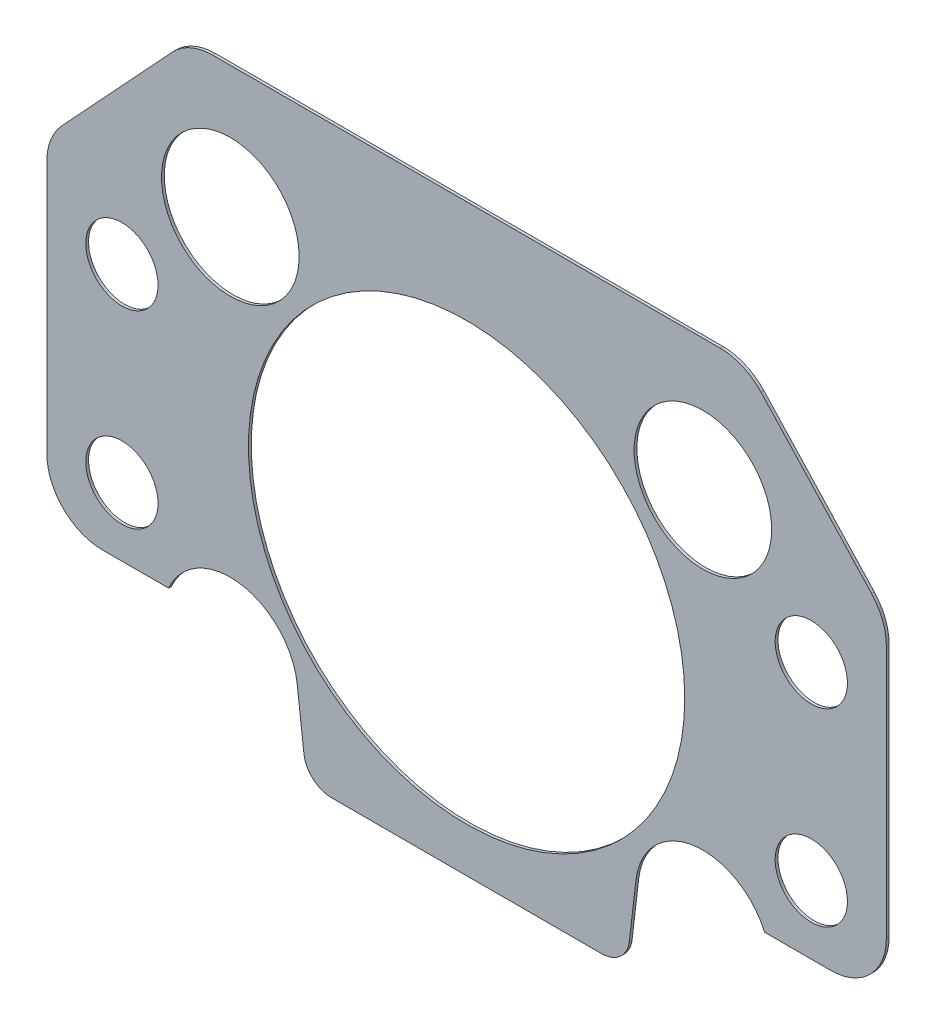
ISO-10303-21;
HEADER;
FILE_DESCRIPTION(('STEP AP214'),'2;1');
FILE_NAME('part.step','',(''),(''),'','','');
FILE_SCHEMA(('AUTOMOTIVE_DESIGN { 1 0 10303 214 1 1 1 1 }'));
ENDSEC;
DATA;
#1=APPLICATION_CONTEXT('core data for automotive mechanical design processes');
#2=APPLICATION_PROTOCOL_DEFINITION('international standard','automotive_design',2000,#1);
#3=PRODUCT_CONTEXT('',#1,'mechanical');
#4=PRODUCT('Part','Part','',(#3));
#5=PRODUCT_RELATED_PRODUCT_CATEGORY('part','',(#4));
#6=PRODUCT_DEFINITION_FORMATION('','',#4);
#7=PRODUCT_DEFINITION_CONTEXT('part definition',#1,'design');
#8=PRODUCT_DEFINITION('design','',#6,#7);
#9=PRODUCT_DEFINITION_SHAPE('','',#8);
#10=(LENGTH_UNIT() NAMED_UNIT(*) SI_UNIT(.MILLI.,.METRE.));
#11=(NAMED_UNIT(*) PLANE_ANGLE_UNIT() SI_UNIT($,.RADIAN.));
#12=(NAMED_UNIT(*) SI_UNIT($,.STERADIAN.) SOLID_ANGLE_UNIT());
#13=UNCERTAINTY_MEASURE_WITH_UNIT(LENGTH_MEASURE(1.E-05),#10,'distance_accuracy_value','');
#14=(GEOMETRIC_REPRESENTATION_CONTEXT(3) GLOBAL_UNCERTAINTY_ASSIGNED_CONTEXT((#13)) GLOBAL_UNIT_ASSIGNED_CONTEXT((#10,
#11,#12)) REPRESENTATION_CONTEXT('',''));
#15=CARTESIAN_POINT('',(0.,0.,0.));
#16=DIRECTION('',(0.,0.,1.));
#17=DIRECTION('',(1.,0.,0.));
#18=AXIS2_PLACEMENT_3D('',#15,#16,#17);
#19=CARTESIAN_POINT('',(-91.2703031380376,95.5,1.));
#20=DIRECTION('',(0.,0.,1.));
#21=DIRECTION('',(1.,0.,0.));
#22=AXIS2_PLACEMENT_3D('',#19,#20,#21);
#23=PLANE('',#22);
#24=CARTESIAN_POINT('',(-124.,-34.,1.));
#25=DIRECTION('',(0.,0.,1.));
#26=DIRECTION('',(1.,0.,0.));
#27=AXIS2_PLACEMENT_3D('',#24,#25,#26);
#28=CIRCLE('',#27,13.);
#29=CARTESIAN_POINT('',(-111.,-34.,1.));
#30=VERTEX_POINT('',#29);
#31=EDGE_CURVE('E645',#30,#30,#28,.T.);
#32=ORIENTED_EDGE('',*,*,#31,.F.);
#33=EDGE_LOOP('',(#32));
#34=FACE_BOUND('',#33,.T.);
#35=CARTESIAN_POINT('',(124.,34.,1.));
#36=DIRECTION('',(0.,0.,1.));
#37=DIRECTION('',(1.,0.,0.));
#38=AXIS2_PLACEMENT_3D('',#35,#36,#37);
#39=CIRCLE('',#38,13.);
#40=CARTESIAN_POINT('',(137.,34.,1.));
#41=VERTEX_POINT('',#40);
#42=EDGE_CURVE('E657',#41,#41,#39,.T.);
#43=ORIENTED_EDGE('',*,*,#42,.F.);
#44=EDGE_LOOP('',(#43));
#45=FACE_BOUND('',#44,.T.);
#46=CARTESIAN_POINT('',(85.,68.25,1.));
#47=DIRECTION('',(0.,0.,1.));
#48=DIRECTION('',(1.,0.,0.));
#49=AXIS2_PLACEMENT_3D('',#46,#47,#48);
#50=CIRCLE('',#49,24.7499999999999);
#51=CARTESIAN_POINT('',(109.75,68.25,1.));
#52=VERTEX_POINT('',#51);
#53=EDGE_CURVE('E669',#52,#52,#50,.T.);
#54=ORIENTED_EDGE('',*,*,#53,.F.);
#55=EDGE_LOOP('',(#54));
#56=FACE_BOUND('',#55,.T.);
#57=DIRECTION('',(-1.,0.,0.));
#58=VECTOR('',#57,1.);
#59=CARTESIAN_POINT('',(91.2703031380375,115.5,1.));
#60=LINE('',#59,#58);
#61=CARTESIAN_POINT('',(91.2703031380375,115.5,1.));
#62=VERTEX_POINT('',#61);
#63=CARTESIAN_POINT('',(-91.2703031380375,115.5,1.));
#64=VERTEX_POINT('',#63);
#65=EDGE_CURVE('E135',#62,#64,#60,.T.);
#66=ORIENTED_EDGE('',*,*,#65,.T.);
#67=CARTESIAN_POINT('',(-91.2703031380376,95.5,1.));
#68=DIRECTION('',(0.,0.,1.));
#69=DIRECTION('',(1.,0.,0.));
#70=AXIS2_PLACEMENT_3D('',#67,#68,#69);
#71=CIRCLE('',#70,20.);
#72=CARTESIAN_POINT('',(-105.935666274802,109.098791272272,1.));
#73=VERTEX_POINT('',#72);
#74=EDGE_CURVE('E356',#64,#73,#71,.T.);
#75=ORIENTED_EDGE('',*,*,#74,.T.);
#76=DIRECTION('',(-0.679939563613621,-0.733268156838219,0.));
#77=VECTOR('',#76,1.);
#78=CARTESIAN_POINT('',(-105.935666274802,109.098791272272,1.));
#79=LINE('',#78,#77);
#80=CARTESIAN_POINT('',(-145.665363136764,66.2530397544698,1.));
#81=VERTEX_POINT('',#80);
#82=EDGE_CURVE('E299',#73,#81,#79,.T.);
#83=ORIENTED_EDGE('',*,*,#82,.T.);
#84=CARTESIAN_POINT('',(-131.,52.6542484821974,1.));
#85=DIRECTION('',(0.,0.,1.));
#86=DIRECTION('',(1.,0.,0.));
#87=AXIS2_PLACEMENT_3D('',#84,#85,#86);
#88=CIRCLE('',#87,20.);
#89=CARTESIAN_POINT('',(-151.,52.6542484821973,1.));
#90=VERTEX_POINT('',#89);
#91=EDGE_CURVE('E318',#81,#90,#88,.T.);
#92=ORIENTED_EDGE('',*,*,#91,.T.);
#93=DIRECTION('',(0.,-1.,0.));
#94=VECTOR('',#93,1.);
#95=CARTESIAN_POINT('',(-151.,52.6542484821973,1.));
#96=LINE('',#95,#94);
#97=CARTESIAN_POINT('',(-151.,-38.4999999999999,1.));
#98=VERTEX_POINT('',#97);
#99=EDGE_CURVE('E315',#90,#98,#96,.T.);
#100=ORIENTED_EDGE('',*,*,#99,.T.);
#101=CARTESIAN_POINT('',(-131.,-38.5,1.));
#102=DIRECTION('',(0.,0.,1.));
#103=DIRECTION('',(1.,0.,0.));
#104=AXIS2_PLACEMENT_3D('',#101,#102,#103);
#105=CIRCLE('',#104,20.);
#106=CARTESIAN_POINT('',(-131.,-58.5,1.));
#107=VERTEX_POINT('',#106);
#108=EDGE_CURVE('E317',#98,#107,#105,.T.);
#109=ORIENTED_EDGE('',*,*,#108,.T.);
#110=DIRECTION('',(1.,0.,0.));
#111=VECTOR('',#110,1.);
#112=CARTESIAN_POINT('',(-131.,-58.5,1.));
#113=LINE('',#112,#111);
#114=CARTESIAN_POINT('',(-107.203603311175,-58.5,1.));
#115=VERTEX_POINT('',#114);
#116=EDGE_CURVE('E320',#107,#115,#113,.T.);
#117=ORIENTED_EDGE('',*,*,#116,.T.);
#118=CARTESIAN_POINT('',(-85.,-68.25,1.));
#119=DIRECTION('',(0.,0.,-1.));
#120=DIRECTION('',(1.,0.,0.));
#121=AXIS2_PLACEMENT_3D('',#118,#119,#120);
#122=CIRCLE('',#121,24.25);
#123=CARTESIAN_POINT('',(-60.9155717470802,-65.4210751636078,1.));
#124=VERTEX_POINT('',#123);
#125=EDGE_CURVE('E326',#115,#124,#122,.T.);
#126=ORIENTED_EDGE('',*,*,#125,.T.);
#127=DIRECTION('',(0.116656694284215,-0.993172299089478,0.));
#128=VECTOR('',#127,1.);
#129=CARTESIAN_POINT('',(-60.9155717470802,-65.4210751636078,1.));
#130=LINE('',#129,#128);
#131=CARTESIAN_POINT('',(-58.5375632713213,-85.6665669428422,1.));
#132=VERTEX_POINT('',#131);
#133=EDGE_CURVE('E328',#124,#132,#130,.T.);
#134=ORIENTED_EDGE('',*,*,#133,.T.);
#135=CARTESIAN_POINT('',(-48.6058402804265,-84.5,1.));
#136=DIRECTION('',(0.,0.,1.));
#137=DIRECTION('',(1.,0.,0.));
#138=AXIS2_PLACEMENT_3D('',#135,#136,#137);
#139=CIRCLE('',#138,9.99999999999999);
#140=CARTESIAN_POINT('',(-48.6058402804265,-94.5,1.));
#141=VERTEX_POINT('',#140);
#142=EDGE_CURVE('E330',#132,#141,#139,.T.);
#143=ORIENTED_EDGE('',*,*,#142,.T.);
#144=DIRECTION('',(1.,0.,0.));
#145=VECTOR('',#144,1.);
#146=CARTESIAN_POINT('',(-48.6058402804265,-94.5,1.));
#147=LINE('',#146,#145);
#148=CARTESIAN_POINT('',(48.6058402804265,-94.5,1.));
#149=VERTEX_POINT('',#148);
#150=EDGE_CURVE('E332',#141,#149,#147,.T.);
#151=ORIENTED_EDGE('',*,*,#150,.T.);
#152=CARTESIAN_POINT('',(48.6058402804265,-84.5,1.));
#153=DIRECTION('',(0.,0.,1.));
#154=DIRECTION('',(1.,0.,0.));
#155=AXIS2_PLACEMENT_3D('',#152,#153,#154);
#156=CIRCLE('',#155,9.99999999999999);
#157=CARTESIAN_POINT('',(58.5375632713213,-85.6665669428422,1.));
#158=VERTEX_POINT('',#157);
#159=EDGE_CURVE('E334',#149,#158,#156,.T.);
#160=ORIENTED_EDGE('',*,*,#159,.T.);
#161=DIRECTION('',(0.116656694284215,0.993172299089478,0.));
#162=VECTOR('',#161,1.);
#163=CARTESIAN_POINT('',(58.5375632713213,-85.6665669428422,1.));
#164=LINE('',#163,#162);
#165=CARTESIAN_POINT('',(60.9155717470802,-65.4210751636078,1.));
#166=VERTEX_POINT('',#165);
#167=EDGE_CURVE('E336',#158,#166,#164,.T.);
#168=ORIENTED_EDGE('',*,*,#167,.T.);
#169=CARTESIAN_POINT('',(85.,-68.25,1.));
#170=DIRECTION('',(0.,0.,-1.));
#171=DIRECTION('',(1.,0.,0.));
#172=AXIS2_PLACEMENT_3D('',#169,#170,#171);
#173=CIRCLE('',#172,24.25);
#174=CARTESIAN_POINT('',(107.203603311175,-58.5,1.));
#175=VERTEX_POINT('',#174);
#176=EDGE_CURVE('E338',#166,#175,#173,.T.);
#177=ORIENTED_EDGE('',*,*,#176,.T.);
#178=DIRECTION('',(1.,0.,0.));
#179=VECTOR('',#178,1.);
#180=CARTESIAN_POINT('',(107.203603311175,-58.5,1.));
#181=LINE('',#180,#179);
#182=CARTESIAN_POINT('',(131.,-58.5,1.));
#183=VERTEX_POINT('',#182);
#184=EDGE_CURVE('E340',#175,#183,#181,.T.);
#185=ORIENTED_EDGE('',*,*,#184,.T.);
#186=CARTESIAN_POINT('',(131.,-38.5,1.));
#187=DIRECTION('',(0.,0.,1.));
#188=DIRECTION('',(1.,0.,0.));
#189=AXIS2_PLACEMENT_3D('',#186,#187,#188);
#190=CIRCLE('',#189,20.);
#191=CARTESIAN_POINT('',(151.,-38.4999999999999,1.));
#192=VERTEX_POINT('',#191);
#193=EDGE_CURVE('E342',#183,#192,#190,.T.);
#194=ORIENTED_EDGE('',*,*,#193,.T.);
#195=DIRECTION('',(0.,1.,0.));
#196=VECTOR('',#195,1.);
#197=CARTESIAN_POINT('',(151.,-38.4999999999999,1.));
#198=LINE('',#197,#196);
#199=CARTESIAN_POINT('',(151.,52.6542484821973,1.));
#200=VERTEX_POINT('',#199);
#201=EDGE_CURVE('E191',#192,#200,#198,.T.);
#202=ORIENTED_EDGE('',*,*,#201,.T.);
#203=CARTESIAN_POINT('',(131.,52.6542484821974,1.));
#204=DIRECTION('',(0.,0.,1.));
#205=DIRECTION('',(1.,0.,0.));
#206=AXIS2_PLACEMENT_3D('',#203,#204,#205);
#207=CIRCLE('',#206,20.);
#208=CARTESIAN_POINT('',(145.665363136764,66.2530397544698,1.));
#209=VERTEX_POINT('',#208);
#210=EDGE_CURVE('E185',#200,#209,#207,.T.);
#211=ORIENTED_EDGE('',*,*,#210,.T.);
#212=DIRECTION('',(-0.679939563613621,0.733268156838219,0.));
#213=VECTOR('',#212,1.);
#214=CARTESIAN_POINT('',(145.665363136764,66.2530397544698,1.));
#215=LINE('',#214,#213);
#216=CARTESIAN_POINT('',(105.935666274802,109.098791272272,1.));
#217=VERTEX_POINT('',#216);
#218=EDGE_CURVE('E189',#209,#217,#215,.T.);
#219=ORIENTED_EDGE('',*,*,#218,.T.);
#220=CARTESIAN_POINT('',(91.2703031380376,95.5,1.));
#221=DIRECTION('',(0.,0.,1.));
#222=DIRECTION('',(1.,0.,0.));
#223=AXIS2_PLACEMENT_3D('',#220,#221,#222);
#224=CIRCLE('',#223,20.);
#225=EDGE_CURVE('E57',#217,#62,#224,.T.);
#226=ORIENTED_EDGE('',*,*,#225,.T.);
#227=EDGE_LOOP('',(#66,#75,#83,#92,#100,#109,#117,#126,#134,#143,#151,#160,#168,#177,#185,#194,
#202,#211,#219,#226));
#228=FACE_BOUND('',#227,.T.);
#229=CARTESIAN_POINT('',(-85.,68.25,1.));
#230=DIRECTION('',(0.,0.,1.));
#231=DIRECTION('',(1.,0.,0.));
#232=AXIS2_PLACEMENT_3D('',#229,#230,#231);
#233=CIRCLE('',#232,24.7499999999999);
#234=CARTESIAN_POINT('',(-60.2500000000001,68.25,1.));
#235=VERTEX_POINT('',#234);
#236=EDGE_CURVE('E211',#235,#235,#233,.T.);
#237=ORIENTED_EDGE('',*,*,#236,.F.);
#238=EDGE_LOOP('',(#237));
#239=FACE_BOUND('',#238,.T.);
#240=CARTESIAN_POINT('',(124.,-34.,1.));
#241=DIRECTION('',(0.,0.,1.));
#242=DIRECTION('',(1.,0.,0.));
#243=AXIS2_PLACEMENT_3D('',#240,#241,#242);
#244=CIRCLE('',#243,13.);
#245=CARTESIAN_POINT('',(137.,-34.,1.));
#246=VERTEX_POINT('',#245);
#247=EDGE_CURVE('E663',#246,#246,#244,.T.);
#248=ORIENTED_EDGE('',*,*,#247,.F.);
#249=EDGE_LOOP('',(#248));
#250=FACE_BOUND('',#249,.T.);
#251=CARTESIAN_POINT('',(-124.,34.,1.));
#252=DIRECTION('',(0.,0.,1.));
#253=DIRECTION('',(1.,0.,0.));
#254=AXIS2_PLACEMENT_3D('',#251,#252,#253);
#255=CIRCLE('',#254,13.);
#256=CARTESIAN_POINT('',(-111.,34.,1.));
#257=VERTEX_POINT('',#256);
#258=EDGE_CURVE('E651',#257,#257,#255,.T.);
#259=ORIENTED_EDGE('',*,*,#258,.F.);
#260=EDGE_LOOP('',(#259));
#261=FACE_BOUND('',#260,.T.);
#262=CARTESIAN_POINT('',(0.,0.,1.));
#263=DIRECTION('',(0.,0.,1.));
#264=DIRECTION('',(1.,0.,0.));
#265=AXIS2_PLACEMENT_3D('',#262,#263,#264);
#266=CIRCLE('',#265,78.475);
#267=CARTESIAN_POINT('',(78.475,0.,1.));
#268=VERTEX_POINT('',#267);
#269=EDGE_CURVE('E636',#268,#268,#266,.T.);
#270=ORIENTED_EDGE('',*,*,#269,.F.);
#271=EDGE_LOOP('',(#270));
#272=FACE_BOUND('',#271,.T.);
#273=ADVANCED_FACE('F40',(#34,#45,#56,#228,#239,#250,#261,#272),#23,.T.);
#274=CARTESIAN_POINT('',(-91.2703031380376,95.5,0.));
#275=DIRECTION('',(0.,0.,1.));
#276=DIRECTION('',(1.,0.,0.));
#277=AXIS2_PLACEMENT_3D('',#274,#275,#276);
#278=PLANE('',#277);
#279=DIRECTION('',(-1.,0.,0.));
#280=VECTOR('',#279,1.);
#281=CARTESIAN_POINT('',(-2.56173769148984,115.5,0.));
#282=LINE('',#281,#280);
#283=CARTESIAN_POINT('',(91.2703031380375,115.5,0.));
#284=VERTEX_POINT('',#283);
#285=CARTESIAN_POINT('',(-91.2703031380375,115.5,0.));
#286=VERTEX_POINT('',#285);
#287=EDGE_CURVE('E129',#284,#286,#282,.T.);
#288=ORIENTED_EDGE('',*,*,#287,.F.);
#289=CARTESIAN_POINT('',(91.2703031380376,95.5,0.));
#290=DIRECTION('',(0.,0.,1.));
#291=DIRECTION('',(1.,0.,0.));
#292=AXIS2_PLACEMENT_3D('',#289,#290,#291);
#293=CIRCLE('',#292,20.);
#294=CARTESIAN_POINT('',(105.935666274802,109.098791272272,0.));
#295=VERTEX_POINT('',#294);
#296=EDGE_CURVE('E245',#295,#284,#293,.T.);
#297=ORIENTED_EDGE('',*,*,#296,.F.);
#298=DIRECTION('',(-0.679939563613621,0.733268156838219,0.));
#299=VECTOR('',#298,1.);
#300=CARTESIAN_POINT('',(145.665363136764,66.2530397544698,0.));
#301=LINE('',#300,#299);
#302=CARTESIAN_POINT('',(145.665363136764,66.2530397544698,0.));
#303=VERTEX_POINT('',#302);
#304=EDGE_CURVE('E122',#303,#295,#301,.T.);
#305=ORIENTED_EDGE('',*,*,#304,.F.);
#306=CARTESIAN_POINT('',(131.,52.6542484821974,0.));
#307=DIRECTION('',(0.,0.,1.));
#308=DIRECTION('',(1.,0.,0.));
#309=AXIS2_PLACEMENT_3D('',#306,#307,#308);
#310=CIRCLE('',#309,20.);
#311=CARTESIAN_POINT('',(151.,52.6542484821973,0.));
#312=VERTEX_POINT('',#311);
#313=EDGE_CURVE('E199',#312,#303,#310,.T.);
#314=ORIENTED_EDGE('',*,*,#313,.F.);
#315=DIRECTION('',(0.,1.,0.));
#316=VECTOR('',#315,1.);
#317=CARTESIAN_POINT('',(151.,-38.4999999999999,0.));
#318=LINE('',#317,#316);
#319=CARTESIAN_POINT('',(151.,-38.4999999999999,0.));
#320=VERTEX_POINT('',#319);
#321=EDGE_CURVE('E241',#320,#312,#318,.T.);
#322=ORIENTED_EDGE('',*,*,#321,.F.);
#323=CARTESIAN_POINT('',(131.,-38.5,0.));
#324=DIRECTION('',(0.,0.,1.));
#325=DIRECTION('',(1.,0.,0.));
#326=AXIS2_PLACEMENT_3D('',#323,#324,#325);
#327=CIRCLE('',#326,20.);
#328=CARTESIAN_POINT('',(131.,-58.5,0.));
#329=VERTEX_POINT('',#328);
#330=EDGE_CURVE('E239',#329,#320,#327,.T.);
#331=ORIENTED_EDGE('',*,*,#330,.F.);
#332=DIRECTION('',(1.,0.,0.));
#333=VECTOR('',#332,1.);
#334=CARTESIAN_POINT('',(107.203603311175,-58.5,0.));
#335=LINE('',#334,#333);
#336=CARTESIAN_POINT('',(107.203603311175,-58.5,0.));
#337=VERTEX_POINT('',#336);
#338=EDGE_CURVE('E237',#337,#329,#335,.T.);
#339=ORIENTED_EDGE('',*,*,#338,.F.);
#340=CARTESIAN_POINT('',(85.,-68.25,0.));
#341=DIRECTION('',(0.,0.,-1.));
#342=DIRECTION('',(1.,0.,0.));
#343=AXIS2_PLACEMENT_3D('',#340,#341,#342);
#344=CIRCLE('',#343,24.25);
#345=CARTESIAN_POINT('',(60.9155717470802,-65.4210751636078,0.));
#346=VERTEX_POINT('',#345);
#347=EDGE_CURVE('E235',#346,#337,#344,.T.);
#348=ORIENTED_EDGE('',*,*,#347,.F.);
#349=DIRECTION('',(0.116656694284215,0.993172299089478,0.));
#350=VECTOR('',#349,1.);
#351=CARTESIAN_POINT('',(58.5375632713213,-85.6665669428422,0.));
#352=LINE('',#351,#350);
#353=CARTESIAN_POINT('',(58.5375632713213,-85.6665669428422,0.));
#354=VERTEX_POINT('',#353);
#355=EDGE_CURVE('E233',#354,#346,#352,.T.);
#356=ORIENTED_EDGE('',*,*,#355,.F.);
#357=CARTESIAN_POINT('',(48.6058402804265,-84.5,0.));
#358=DIRECTION('',(0.,0.,1.));
#359=DIRECTION('',(1.,0.,0.));
#360=AXIS2_PLACEMENT_3D('',#357,#358,#359);
#361=CIRCLE('',#360,9.99999999999999);
#362=CARTESIAN_POINT('',(48.6058402804265,-94.5,0.));
#363=VERTEX_POINT('',#362);
#364=EDGE_CURVE('E231',#363,#354,#361,.T.);
#365=ORIENTED_EDGE('',*,*,#364,.F.);
#366=DIRECTION('',(1.,0.,0.));
#367=VECTOR('',#366,1.);
#368=CARTESIAN_POINT('',(-48.6058402804265,-94.5,0.));
#369=LINE('',#368,#367);
#370=CARTESIAN_POINT('',(-48.6058402804265,-94.5,0.));
#371=VERTEX_POINT('',#370);
#372=EDGE_CURVE('E229',#371,#363,#369,.T.);
#373=ORIENTED_EDGE('',*,*,#372,.F.);
#374=CARTESIAN_POINT('',(-48.6058402804265,-84.5,0.));
#375=DIRECTION('',(0.,0.,1.));
#376=DIRECTION('',(1.,0.,0.));
#377=AXIS2_PLACEMENT_3D('',#374,#375,#376);
#378=CIRCLE('',#377,9.99999999999999);
#379=CARTESIAN_POINT('',(-58.5375632713213,-85.6665669428422,0.));
#380=VERTEX_POINT('',#379);
#381=EDGE_CURVE('E227',#380,#371,#378,.T.);
#382=ORIENTED_EDGE('',*,*,#381,.F.);
#383=DIRECTION('',(0.116656694284215,-0.993172299089478,0.));
#384=VECTOR('',#383,1.);
#385=CARTESIAN_POINT('',(-60.9155717470802,-65.4210751636078,0.));
#386=LINE('',#385,#384);
#387=CARTESIAN_POINT('',(-60.9155717470802,-65.4210751636078,0.));
#388=VERTEX_POINT('',#387);
#389=EDGE_CURVE('E225',#388,#380,#386,.T.);
#390=ORIENTED_EDGE('',*,*,#389,.F.);
#391=CARTESIAN_POINT('',(-85.,-68.25,0.));
#392=DIRECTION('',(0.,0.,-1.));
#393=DIRECTION('',(1.,0.,0.));
#394=AXIS2_PLACEMENT_3D('',#391,#392,#393);
#395=CIRCLE('',#394,24.25);
#396=CARTESIAN_POINT('',(-107.203603311175,-58.5,0.));
#397=VERTEX_POINT('',#396);
#398=EDGE_CURVE('E223',#397,#388,#395,.T.);
#399=ORIENTED_EDGE('',*,*,#398,.F.);
#400=DIRECTION('',(1.,0.,0.));
#401=VECTOR('',#400,1.);
#402=CARTESIAN_POINT('',(-131.,-58.5,0.));
#403=LINE('',#402,#401);
#404=CARTESIAN_POINT('',(-131.,-58.5,0.));
#405=VERTEX_POINT('',#404);
#406=EDGE_CURVE('E221',#405,#397,#403,.T.);
#407=ORIENTED_EDGE('',*,*,#406,.F.);
#408=CARTESIAN_POINT('',(-131.,-38.5,0.));
#409=DIRECTION('',(0.,0.,1.));
#410=DIRECTION('',(1.,0.,0.));
#411=AXIS2_PLACEMENT_3D('',#408,#409,#410);
#412=CIRCLE('',#411,20.);
#413=CARTESIAN_POINT('',(-151.,-38.4999999999999,0.));
#414=VERTEX_POINT('',#413);
#415=EDGE_CURVE('E219',#414,#405,#412,.T.);
#416=ORIENTED_EDGE('',*,*,#415,.F.);
#417=DIRECTION('',(0.,-1.,0.));
#418=VECTOR('',#417,1.);
#419=CARTESIAN_POINT('',(-151.,52.6542484821973,0.));
#420=LINE('',#419,#418);
#421=CARTESIAN_POINT('',(-151.,52.6542484821973,0.));
#422=VERTEX_POINT('',#421);
#423=EDGE_CURVE('E217',#422,#414,#420,.T.);
#424=ORIENTED_EDGE('',*,*,#423,.F.);
#425=CARTESIAN_POINT('',(-131.,52.6542484821974,0.));
#426=DIRECTION('',(0.,0.,1.));
#427=DIRECTION('',(1.,0.,0.));
#428=AXIS2_PLACEMENT_3D('',#425,#426,#427);
#429=CIRCLE('',#428,20.);
#430=CARTESIAN_POINT('',(-145.665363136764,66.2530397544698,0.));
#431=VERTEX_POINT('',#430);
#432=EDGE_CURVE('E215',#431,#422,#429,.T.);
#433=ORIENTED_EDGE('',*,*,#432,.F.);
#434=DIRECTION('',(-0.679939563613621,-0.733268156838219,0.));
#435=VECTOR('',#434,1.);
#436=CARTESIAN_POINT('',(-105.935666274802,109.098791272272,0.));
#437=LINE('',#436,#435);
#438=CARTESIAN_POINT('',(-105.935666274802,109.098791272272,0.));
#439=VERTEX_POINT('',#438);
#440=EDGE_CURVE('E213',#439,#431,#437,.T.);
#441=ORIENTED_EDGE('',*,*,#440,.F.);
#442=CARTESIAN_POINT('',(-91.2703031380376,95.5,0.));
#443=DIRECTION('',(0.,0.,1.));
#444=DIRECTION('',(1.,0.,0.));
#445=AXIS2_PLACEMENT_3D('',#442,#443,#444);
#446=CIRCLE('',#445,20.);
#447=EDGE_CURVE('E210',#286,#439,#446,.T.);
#448=ORIENTED_EDGE('',*,*,#447,.F.);
#449=EDGE_LOOP('',(#288,#297,#305,#314,#322,#331,#339,#348,#356,#365,#373,#382,#390,#399,#407,
#416,#424,#433,#441,#448));
#450=FACE_BOUND('',#449,.T.);
#451=CARTESIAN_POINT('',(-85.,68.25,0.));
#452=DIRECTION('',(0.,0.,1.));
#453=DIRECTION('',(1.,0.,0.));
#454=AXIS2_PLACEMENT_3D('',#451,#452,#453);
#455=CIRCLE('',#454,24.7499999999999);
#456=CARTESIAN_POINT('',(-60.2500000000001,68.25,0.));
#457=VERTEX_POINT('',#456);
#458=EDGE_CURVE('E360',#457,#457,#455,.T.);
#459=ORIENTED_EDGE('',*,*,#458,.T.);
#460=EDGE_LOOP('',(#459));
#461=FACE_BOUND('',#460,.T.);
#462=CARTESIAN_POINT('',(85.,68.25,0.));
#463=DIRECTION('',(0.,0.,1.));
#464=DIRECTION('',(1.,0.,0.));
#465=AXIS2_PLACEMENT_3D('',#462,#463,#464);
#466=CIRCLE('',#465,24.7499999999999);
#467=CARTESIAN_POINT('',(109.75,68.25,0.));
#468=VERTEX_POINT('',#467);
#469=EDGE_CURVE('E666',#468,#468,#466,.T.);
#470=ORIENTED_EDGE('',*,*,#469,.T.);
#471=EDGE_LOOP('',(#470));
#472=FACE_BOUND('',#471,.T.);
#473=CARTESIAN_POINT('',(124.,-34.,0.));
#474=DIRECTION('',(0.,0.,1.));
#475=DIRECTION('',(1.,0.,0.));
#476=AXIS2_PLACEMENT_3D('',#473,#474,#475);
#477=CIRCLE('',#476,13.);
#478=CARTESIAN_POINT('',(137.,-34.,0.));
#479=VERTEX_POINT('',#478);
#480=EDGE_CURVE('E660',#479,#479,#477,.T.);
#481=ORIENTED_EDGE('',*,*,#480,.T.);
#482=EDGE_LOOP('',(#481));
#483=FACE_BOUND('',#482,.T.);
#484=CARTESIAN_POINT('',(124.,34.,0.));
#485=DIRECTION('',(0.,0.,1.));
#486=DIRECTION('',(1.,0.,0.));
#487=AXIS2_PLACEMENT_3D('',#484,#485,#486);
#488=CIRCLE('',#487,13.);
#489=CARTESIAN_POINT('',(137.,34.,0.));
#490=VERTEX_POINT('',#489);
#491=EDGE_CURVE('E654',#490,#490,#488,.T.);
#492=ORIENTED_EDGE('',*,*,#491,.T.);
#493=EDGE_LOOP('',(#492));
#494=FACE_BOUND('',#493,.T.);
#495=CARTESIAN_POINT('',(-124.,34.,0.));
#496=DIRECTION('',(0.,0.,1.));
#497=DIRECTION('',(1.,0.,0.));
#498=AXIS2_PLACEMENT_3D('',#495,#496,#497);
#499=CIRCLE('',#498,13.);
#500=CARTESIAN_POINT('',(-111.,34.,0.));
#501=VERTEX_POINT('',#500);
#502=EDGE_CURVE('E648',#501,#501,#499,.T.);
#503=ORIENTED_EDGE('',*,*,#502,.T.);
#504=EDGE_LOOP('',(#503));
#505=FACE_BOUND('',#504,.T.);
#506=CARTESIAN_POINT('',(-124.,-34.,0.));
#507=DIRECTION('',(0.,0.,1.));
#508=DIRECTION('',(1.,0.,0.));
#509=AXIS2_PLACEMENT_3D('',#506,#507,#508);
#510=CIRCLE('',#509,13.);
#511=CARTESIAN_POINT('',(-111.,-34.,0.));
#512=VERTEX_POINT('',#511);
#513=EDGE_CURVE('E642',#512,#512,#510,.T.);
#514=ORIENTED_EDGE('',*,*,#513,.T.);
#515=EDGE_LOOP('',(#514));
#516=FACE_BOUND('',#515,.T.);
#517=CARTESIAN_POINT('',(0.,0.,0.));
#518=DIRECTION('',(0.,0.,1.));
#519=DIRECTION('',(1.,0.,0.));
#520=AXIS2_PLACEMENT_3D('',#517,#518,#519);
#521=CIRCLE('',#520,78.475);
#522=CARTESIAN_POINT('',(78.475,0.,0.));
#523=VERTEX_POINT('',#522);
#524=EDGE_CURVE('E639',#523,#523,#521,.T.);
#525=ORIENTED_EDGE('',*,*,#524,.T.);
#526=EDGE_LOOP('',(#525));
#527=FACE_BOUND('',#526,.T.);
#528=ADVANCED_FACE('F303',(#450,#461,#472,#483,#494,#505,#516,#527),#278,.F.);
#529=CARTESIAN_POINT('',(-2.56173769148984,115.5,1.));
#530=DIRECTION('',(0.,-1.,0.));
#531=DIRECTION('',(1.,0.,0.));
#532=AXIS2_PLACEMENT_3D('',#529,#530,#531);
#533=PLANE('',#532);
#534=ORIENTED_EDGE('',*,*,#287,.T.);
#535=DIRECTION('',(0.,0.,-1.));
#536=VECTOR('',#535,1.);
#537=CARTESIAN_POINT('',(-91.2703031380375,115.5,1.));
#538=LINE('',#537,#536);
#539=EDGE_CURVE('E11',#64,#286,#538,.T.);
#540=ORIENTED_EDGE('',*,*,#539,.F.);
#541=ORIENTED_EDGE('',*,*,#65,.F.);
#542=DIRECTION('',(0.,0.,-1.));
#543=VECTOR('',#542,1.);
#544=CARTESIAN_POINT('',(91.2703031380375,115.5,1.));
#545=LINE('',#544,#543);
#546=EDGE_CURVE('E205',#62,#284,#545,.T.);
#547=ORIENTED_EDGE('',*,*,#546,.T.);
#548=EDGE_LOOP('',(#534,#540,#541,#547));
#549=FACE_BOUND('',#548,.T.);
#550=ADVANCED_FACE('F42',(#549),#533,.F.);
#551=CARTESIAN_POINT('',(-91.2703031380376,95.5,1.));
#552=DIRECTION('',(0.,0.,-1.));
#553=DIRECTION('',(-1.,0.,0.));
#554=AXIS2_PLACEMENT_3D('',#551,#552,#553);
#555=CYLINDRICAL_SURFACE('',#554,20.);
#556=ORIENTED_EDGE('',*,*,#447,.T.);
#557=DIRECTION('',(0.,0.,-1.));
#558=VECTOR('',#557,1.);
#559=CARTESIAN_POINT('',(-105.935666274802,109.098791272272,1.));
#560=LINE('',#559,#558);
#561=EDGE_CURVE('E49',#73,#439,#560,.T.);
#562=ORIENTED_EDGE('',*,*,#561,.F.);
#563=ORIENTED_EDGE('',*,*,#74,.F.);
#564=ORIENTED_EDGE('',*,*,#539,.T.);
#565=EDGE_LOOP('',(#556,#562,#563,#564));
#566=FACE_BOUND('',#565,.T.);
#567=ADVANCED_FACE('F362',(#566),#555,.T.);
#568=CARTESIAN_POINT('',(-105.935666274802,109.098791272272,1.));
#569=DIRECTION('',(0.733268156838219,-0.679939563613621,0.));
#570=DIRECTION('',(0.679939563613621,0.733268156838219,0.));
#571=AXIS2_PLACEMENT_3D('',#568,#569,#570);
#572=PLANE('',#571);
#573=ORIENTED_EDGE('',*,*,#440,.T.);
#574=DIRECTION('',(0.,0.,-1.));
#575=VECTOR('',#574,1.);
#576=CARTESIAN_POINT('',(-145.665363136764,66.2530397544698,1.));
#577=LINE('',#576,#575);
#578=EDGE_CURVE('E290',#81,#431,#577,.T.);
#579=ORIENTED_EDGE('',*,*,#578,.F.);
#580=ORIENTED_EDGE('',*,*,#82,.F.);
#581=ORIENTED_EDGE('',*,*,#561,.T.);
#582=EDGE_LOOP('',(#573,#579,#580,#581));
#583=FACE_BOUND('',#582,.T.);
#584=ADVANCED_FACE('F297',(#583),#572,.F.);
#585=CARTESIAN_POINT('',(-131.,52.6542484821974,1.));
#586=DIRECTION('',(0.,0.,-1.));
#587=DIRECTION('',(-1.,0.,0.));
#588=AXIS2_PLACEMENT_3D('',#585,#586,#587);
#589=CYLINDRICAL_SURFACE('',#588,20.);
#590=ORIENTED_EDGE('',*,*,#432,.T.);
#591=DIRECTION('',(0.,0.,-1.));
#592=VECTOR('',#591,1.);
#593=CARTESIAN_POINT('',(-151.,52.6542484821973,1.));
#594=LINE('',#593,#592);
#595=EDGE_CURVE('E287',#90,#422,#594,.T.);
#596=ORIENTED_EDGE('',*,*,#595,.F.);
#597=ORIENTED_EDGE('',*,*,#91,.F.);
#598=ORIENTED_EDGE('',*,*,#578,.T.);
#599=EDGE_LOOP('',(#590,#596,#597,#598));
#600=FACE_BOUND('',#599,.T.);
#601=ADVANCED_FACE('F309',(#600),#589,.T.);
#602=CARTESIAN_POINT('',(-151.,52.6542484821973,1.));
#603=DIRECTION('',(1.,0.,0.));
#604=DIRECTION('',(0.,1.,0.));
#605=AXIS2_PLACEMENT_3D('',#602,#603,#604);
#606=PLANE('',#605);
#607=ORIENTED_EDGE('',*,*,#423,.T.);
#608=DIRECTION('',(0.,0.,-1.));
#609=VECTOR('',#608,1.);
#610=CARTESIAN_POINT('',(-151.,-38.4999999999999,1.));
#611=LINE('',#610,#609);
#612=EDGE_CURVE('E284',#98,#414,#611,.T.);
#613=ORIENTED_EDGE('',*,*,#612,.F.);
#614=ORIENTED_EDGE('',*,*,#99,.F.);
#615=ORIENTED_EDGE('',*,*,#595,.T.);
#616=EDGE_LOOP('',(#607,#613,#614,#615));
#617=FACE_BOUND('',#616,.T.);
#618=ADVANCED_FACE('F313',(#617),#606,.F.);
#619=CARTESIAN_POINT('',(-131.,-38.5,1.));
#620=DIRECTION('',(0.,0.,-1.));
#621=DIRECTION('',(-1.,0.,0.));
#622=AXIS2_PLACEMENT_3D('',#619,#620,#621);
#623=CYLINDRICAL_SURFACE('',#622,20.);
#624=ORIENTED_EDGE('',*,*,#415,.T.);
#625=DIRECTION('',(0.,0.,-1.));
#626=VECTOR('',#625,1.);
#627=CARTESIAN_POINT('',(-131.,-58.5,1.));
#628=LINE('',#627,#626);
#629=EDGE_CURVE('E281',#107,#405,#628,.T.);
#630=ORIENTED_EDGE('',*,*,#629,.F.);
#631=ORIENTED_EDGE('',*,*,#108,.F.);
#632=ORIENTED_EDGE('',*,*,#612,.T.);
#633=EDGE_LOOP('',(#624,#630,#631,#632));
#634=FACE_BOUND('',#633,.T.);
#635=ADVANCED_FACE('F427',(#634),#623,.T.);
#636=CARTESIAN_POINT('',(-131.,-58.5,1.));
#637=DIRECTION('',(0.,1.,0.));
#638=DIRECTION('',(-1.,0.,0.));
#639=AXIS2_PLACEMENT_3D('',#636,#637,#638);
#640=PLANE('',#639);
#641=ORIENTED_EDGE('',*,*,#406,.T.);
#642=DIRECTION('',(0.,0.,-1.));
#643=VECTOR('',#642,1.);
#644=CARTESIAN_POINT('',(-107.203603311175,-58.5,1.));
#645=LINE('',#644,#643);
#646=EDGE_CURVE('E278',#115,#397,#645,.T.);
#647=ORIENTED_EDGE('',*,*,#646,.F.);
#648=ORIENTED_EDGE('',*,*,#116,.F.);
#649=ORIENTED_EDGE('',*,*,#629,.T.);
#650=EDGE_LOOP('',(#641,#647,#648,#649));
#651=FACE_BOUND('',#650,.T.);
#652=ADVANCED_FACE('F423',(#651),#640,.F.);
#653=CARTESIAN_POINT('',(-85.,-68.25,1.));
#654=DIRECTION('',(0.,0.,-1.));
#655=DIRECTION('',(-1.,0.,0.));
#656=AXIS2_PLACEMENT_3D('',#653,#654,#655);
#657=CYLINDRICAL_SURFACE('',#656,24.25);
#658=ORIENTED_EDGE('',*,*,#398,.T.);
#659=DIRECTION('',(0.,0.,-1.));
#660=VECTOR('',#659,1.);
#661=CARTESIAN_POINT('',(-60.9155717470802,-65.4210751636078,1.));
#662=LINE('',#661,#660);
#663=EDGE_CURVE('E275',#124,#388,#662,.T.);
#664=ORIENTED_EDGE('',*,*,#663,.F.);
#665=ORIENTED_EDGE('',*,*,#125,.F.);
#666=ORIENTED_EDGE('',*,*,#646,.T.);
#667=EDGE_LOOP('',(#658,#664,#665,#666));
#668=FACE_BOUND('',#667,.T.);
#669=ADVANCED_FACE('F419',(#668),#657,.F.);
#670=CARTESIAN_POINT('',(-60.9155717470802,-65.4210751636078,1.));
#671=DIRECTION('',(0.993172299089478,0.116656694284215,0.));
#672=DIRECTION('',(-0.116656694284215,0.993172299089478,0.));
#673=AXIS2_PLACEMENT_3D('',#670,#671,#672);
#674=PLANE('',#673);
#675=ORIENTED_EDGE('',*,*,#389,.T.);
#676=DIRECTION('',(0.,0.,-1.));
#677=VECTOR('',#676,1.);
#678=CARTESIAN_POINT('',(-58.5375632713213,-85.6665669428422,1.));
#679=LINE('',#678,#677);
#680=EDGE_CURVE('E272',#132,#380,#679,.T.);
#681=ORIENTED_EDGE('',*,*,#680,.F.);
#682=ORIENTED_EDGE('',*,*,#133,.F.);
#683=ORIENTED_EDGE('',*,*,#663,.T.);
#684=EDGE_LOOP('',(#675,#681,#682,#683));
#685=FACE_BOUND('',#684,.T.);
#686=ADVANCED_FACE('F415',(#685),#674,.F.);
#687=CARTESIAN_POINT('',(-48.6058402804265,-84.5,1.));
#688=DIRECTION('',(0.,0.,-1.));
#689=DIRECTION('',(-1.,0.,0.));
#690=AXIS2_PLACEMENT_3D('',#687,#688,#689);
#691=CYLINDRICAL_SURFACE('',#690,9.99999999999999);
#692=ORIENTED_EDGE('',*,*,#381,.T.);
#693=DIRECTION('',(0.,0.,-1.));
#694=VECTOR('',#693,1.);
#695=CARTESIAN_POINT('',(-48.6058402804265,-94.5,1.));
#696=LINE('',#695,#694);
#697=EDGE_CURVE('E269',#141,#371,#696,.T.);
#698=ORIENTED_EDGE('',*,*,#697,.F.);
#699=ORIENTED_EDGE('',*,*,#142,.F.);
#700=ORIENTED_EDGE('',*,*,#680,.T.);
#701=EDGE_LOOP('',(#692,#698,#699,#700));
#702=FACE_BOUND('',#701,.T.);
#703=ADVANCED_FACE('F411',(#702),#691,.T.);
#704=CARTESIAN_POINT('',(-48.6058402804265,-94.5,1.));
#705=DIRECTION('',(0.,1.,0.));
#706=DIRECTION('',(0.,0.,1.));
#707=AXIS2_PLACEMENT_3D('',#704,#705,#706);
#708=PLANE('',#707);
#709=ORIENTED_EDGE('',*,*,#372,.T.);
#710=DIRECTION('',(0.,0.,-1.));
#711=VECTOR('',#710,1.);
#712=CARTESIAN_POINT('',(48.6058402804265,-94.5,1.));
#713=LINE('',#712,#711);
#714=EDGE_CURVE('E266',#149,#363,#713,.T.);
#715=ORIENTED_EDGE('',*,*,#714,.F.);
#716=ORIENTED_EDGE('',*,*,#150,.F.);
#717=ORIENTED_EDGE('',*,*,#697,.T.);
#718=EDGE_LOOP('',(#709,#715,#716,#717));
#719=FACE_BOUND('',#718,.T.);
#720=ADVANCED_FACE('F407',(#719),#708,.F.);
#721=CARTESIAN_POINT('',(48.6058402804265,-84.5,1.));
#722=DIRECTION('',(0.,0.,-1.));
#723=DIRECTION('',(-1.,0.,0.));
#724=AXIS2_PLACEMENT_3D('',#721,#722,#723);
#725=CYLINDRICAL_SURFACE('',#724,9.99999999999999);
#726=ORIENTED_EDGE('',*,*,#364,.T.);
#727=DIRECTION('',(0.,0.,-1.));
#728=VECTOR('',#727,1.);
#729=CARTESIAN_POINT('',(58.5375632713213,-85.6665669428422,1.));
#730=LINE('',#729,#728);
#731=EDGE_CURVE('E263',#158,#354,#730,.T.);
#732=ORIENTED_EDGE('',*,*,#731,.F.);
#733=ORIENTED_EDGE('',*,*,#159,.F.);
#734=ORIENTED_EDGE('',*,*,#714,.T.);
#735=EDGE_LOOP('',(#726,#732,#733,#734));
#736=FACE_BOUND('',#735,.T.);
#737=ADVANCED_FACE('F403',(#736),#725,.T.);
#738=CARTESIAN_POINT('',(58.5375632713213,-85.6665669428422,1.));
#739=DIRECTION('',(-0.993172299089478,0.116656694284215,0.));
#740=DIRECTION('',(-0.116656694284215,-0.993172299089478,0.));
#741=AXIS2_PLACEMENT_3D('',#738,#739,#740);
#742=PLANE('',#741);
#743=ORIENTED_EDGE('',*,*,#355,.T.);
#744=DIRECTION('',(0.,0.,-1.));
#745=VECTOR('',#744,1.);
#746=CARTESIAN_POINT('',(60.9155717470802,-65.4210751636078,1.));
#747=LINE('',#746,#745);
#748=EDGE_CURVE('E260',#166,#346,#747,.T.);
#749=ORIENTED_EDGE('',*,*,#748,.F.);
#750=ORIENTED_EDGE('',*,*,#167,.F.);
#751=ORIENTED_EDGE('',*,*,#731,.T.);
#752=EDGE_LOOP('',(#743,#749,#750,#751));
#753=FACE_BOUND('',#752,.T.);
#754=ADVANCED_FACE('F399',(#753),#742,.F.);
#755=CARTESIAN_POINT('',(85.,-68.25,1.));
#756=DIRECTION('',(0.,0.,-1.));
#757=DIRECTION('',(-1.,0.,0.));
#758=AXIS2_PLACEMENT_3D('',#755,#756,#757);
#759=CYLINDRICAL_SURFACE('',#758,24.25);
#760=ORIENTED_EDGE('',*,*,#347,.T.);
#761=DIRECTION('',(0.,0.,-1.));
#762=VECTOR('',#761,1.);
#763=CARTESIAN_POINT('',(107.203603311175,-58.5,1.));
#764=LINE('',#763,#762);
#765=EDGE_CURVE('E257',#175,#337,#764,.T.);
#766=ORIENTED_EDGE('',*,*,#765,.F.);
#767=ORIENTED_EDGE('',*,*,#176,.F.);
#768=ORIENTED_EDGE('',*,*,#748,.T.);
#769=EDGE_LOOP('',(#760,#766,#767,#768));
#770=FACE_BOUND('',#769,.T.);
#771=ADVANCED_FACE('F395',(#770),#759,.F.);
#772=CARTESIAN_POINT('',(107.203603311175,-58.5,1.));
#773=DIRECTION('',(0.,1.,0.));
#774=DIRECTION('',(-1.,0.,0.));
#775=AXIS2_PLACEMENT_3D('',#772,#773,#774);
#776=PLANE('',#775);
#777=ORIENTED_EDGE('',*,*,#338,.T.);
#778=DIRECTION('',(0.,0.,-1.));
#779=VECTOR('',#778,1.);
#780=CARTESIAN_POINT('',(131.,-58.5,1.));
#781=LINE('',#780,#779);
#782=EDGE_CURVE('E254',#183,#329,#781,.T.);
#783=ORIENTED_EDGE('',*,*,#782,.F.);
#784=ORIENTED_EDGE('',*,*,#184,.F.);
#785=ORIENTED_EDGE('',*,*,#765,.T.);
#786=EDGE_LOOP('',(#777,#783,#784,#785));
#787=FACE_BOUND('',#786,.T.);
#788=ADVANCED_FACE('F392',(#787),#776,.F.);
#789=CARTESIAN_POINT('',(131.,-38.5,1.));
#790=DIRECTION('',(0.,0.,-1.));
#791=DIRECTION('',(-1.,0.,0.));
#792=AXIS2_PLACEMENT_3D('',#789,#790,#791);
#793=CYLINDRICAL_SURFACE('',#792,20.);
#794=ORIENTED_EDGE('',*,*,#330,.T.);
#795=DIRECTION('',(0.,0.,-1.));
#796=VECTOR('',#795,1.);
#797=CARTESIAN_POINT('',(151.,-38.4999999999999,1.));
#798=LINE('',#797,#796);
#799=EDGE_CURVE('E251',#192,#320,#798,.T.);
#800=ORIENTED_EDGE('',*,*,#799,.F.);
#801=ORIENTED_EDGE('',*,*,#193,.F.);
#802=ORIENTED_EDGE('',*,*,#782,.T.);
#803=EDGE_LOOP('',(#794,#800,#801,#802));
#804=FACE_BOUND('',#803,.T.);
#805=ADVANCED_FACE('F348',(#804),#793,.T.);
#806=CARTESIAN_POINT('',(151.,-38.4999999999999,1.));
#807=DIRECTION('',(-1.,0.,0.));
#808=DIRECTION('',(0.,-1.,0.));
#809=AXIS2_PLACEMENT_3D('',#806,#807,#808);
#810=PLANE('',#809);
#811=ORIENTED_EDGE('',*,*,#321,.T.);
#812=DIRECTION('',(0.,0.,-1.));
#813=VECTOR('',#812,1.);
#814=CARTESIAN_POINT('',(151.,52.6542484821973,1.));
#815=LINE('',#814,#813);
#816=EDGE_CURVE('E200',#200,#312,#815,.T.);
#817=ORIENTED_EDGE('',*,*,#816,.F.);
#818=ORIENTED_EDGE('',*,*,#201,.F.);
#819=ORIENTED_EDGE('',*,*,#799,.T.);
#820=EDGE_LOOP('',(#811,#817,#818,#819));
#821=FACE_BOUND('',#820,.T.);
#822=ADVANCED_FACE('F352',(#821),#810,.F.);
#823=CARTESIAN_POINT('',(131.,52.6542484821974,1.));
#824=DIRECTION('',(0.,0.,-1.));
#825=DIRECTION('',(-1.,0.,0.));
#826=AXIS2_PLACEMENT_3D('',#823,#824,#825);
#827=CYLINDRICAL_SURFACE('',#826,20.);
#828=ORIENTED_EDGE('',*,*,#313,.T.);
#829=DIRECTION('',(0.,0.,-1.));
#830=VECTOR('',#829,1.);
#831=CARTESIAN_POINT('',(145.665363136764,66.2530397544698,1.));
#832=LINE('',#831,#830);
#833=EDGE_CURVE('E196',#209,#303,#832,.T.);
#834=ORIENTED_EDGE('',*,*,#833,.F.);
#835=ORIENTED_EDGE('',*,*,#210,.F.);
#836=ORIENTED_EDGE('',*,*,#816,.T.);
#837=EDGE_LOOP('',(#828,#834,#835,#836));
#838=FACE_BOUND('',#837,.T.);
#839=ADVANCED_FACE('F197',(#838),#827,.T.);
#840=CARTESIAN_POINT('',(145.665363136764,66.2530397544698,1.));
#841=DIRECTION('',(-0.733268156838219,-0.679939563613621,0.));
#842=DIRECTION('',(0.679939563613621,-0.733268156838219,0.));
#843=AXIS2_PLACEMENT_3D('',#840,#841,#842);
#844=PLANE('',#843);
#845=ORIENTED_EDGE('',*,*,#304,.T.);
#846=DIRECTION('',(0.,0.,-1.));
#847=VECTOR('',#846,1.);
#848=CARTESIAN_POINT('',(105.935666274802,109.098791272272,1.));
#849=LINE('',#848,#847);
#850=EDGE_CURVE('E201',#217,#295,#849,.T.);
#851=ORIENTED_EDGE('',*,*,#850,.F.);
#852=ORIENTED_EDGE('',*,*,#218,.F.);
#853=ORIENTED_EDGE('',*,*,#833,.T.);
#854=EDGE_LOOP('',(#845,#851,#852,#853));
#855=FACE_BOUND('',#854,.T.);
#856=ADVANCED_FACE('F203',(#855),#844,.F.);
#857=CARTESIAN_POINT('',(91.2703031380376,95.5,1.));
#858=DIRECTION('',(0.,0.,-1.));
#859=DIRECTION('',(-1.,0.,0.));
#860=AXIS2_PLACEMENT_3D('',#857,#858,#859);
#861=CYLINDRICAL_SURFACE('',#860,20.);
#862=ORIENTED_EDGE('',*,*,#296,.T.);
#863=ORIENTED_EDGE('',*,*,#546,.F.);
#864=ORIENTED_EDGE('',*,*,#225,.F.);
#865=ORIENTED_EDGE('',*,*,#850,.T.);
#866=EDGE_LOOP('',(#862,#863,#864,#865));
#867=FACE_BOUND('',#866,.T.);
#868=ADVANCED_FACE('F354',(#867),#861,.T.);
#869=CARTESIAN_POINT('',(-85.,68.25,1.));
#870=DIRECTION('',(0.,0.,-1.));
#871=DIRECTION('',(-1.,0.,0.));
#872=AXIS2_PLACEMENT_3D('',#869,#870,#871);
#873=CYLINDRICAL_SURFACE('',#872,24.7499999999999);
#874=ORIENTED_EDGE('',*,*,#236,.T.);
#875=EDGE_LOOP('',(#874));
#876=FACE_BOUND('',#875,.T.);
#877=ORIENTED_EDGE('',*,*,#458,.F.);
#878=EDGE_LOOP('',(#877));
#879=FACE_BOUND('',#878,.T.);
#880=ADVANCED_FACE('F379',(#876,#879),#873,.F.);
#881=CARTESIAN_POINT('',(85.,68.25,1.));
#882=DIRECTION('',(0.,0.,-1.));
#883=DIRECTION('',(-1.,0.,0.));
#884=AXIS2_PLACEMENT_3D('',#881,#882,#883);
#885=CYLINDRICAL_SURFACE('',#884,24.7499999999999);
#886=ORIENTED_EDGE('',*,*,#53,.T.);
#887=EDGE_LOOP('',(#886));
#888=FACE_BOUND('',#887,.T.);
#889=ORIENTED_EDGE('',*,*,#469,.F.);
#890=EDGE_LOOP('',(#889));
#891=FACE_BOUND('',#890,.T.);
#892=ADVANCED_FACE('F526',(#888,#891),#885,.F.);
#893=CARTESIAN_POINT('',(124.,-34.,1.));
#894=DIRECTION('',(0.,0.,-1.));
#895=DIRECTION('',(-1.,0.,0.));
#896=AXIS2_PLACEMENT_3D('',#893,#894,#895);
#897=CYLINDRICAL_SURFACE('',#896,13.);
#898=ORIENTED_EDGE('',*,*,#247,.T.);
#899=EDGE_LOOP('',(#898));
#900=FACE_BOUND('',#899,.T.);
#901=ORIENTED_EDGE('',*,*,#480,.F.);
#902=EDGE_LOOP('',(#901));
#903=FACE_BOUND('',#902,.T.);
#904=ADVANCED_FACE('F534',(#900,#903),#897,.F.);
#905=CARTESIAN_POINT('',(124.,34.,1.));
#906=DIRECTION('',(0.,0.,-1.));
#907=DIRECTION('',(-1.,0.,0.));
#908=AXIS2_PLACEMENT_3D('',#905,#906,#907);
#909=CYLINDRICAL_SURFACE('',#908,13.);
#910=ORIENTED_EDGE('',*,*,#42,.T.);
#911=EDGE_LOOP('',(#910));
#912=FACE_BOUND('',#911,.T.);
#913=ORIENTED_EDGE('',*,*,#491,.F.);
#914=EDGE_LOOP('',(#913));
#915=FACE_BOUND('',#914,.T.);
#916=ADVANCED_FACE('F542',(#912,#915),#909,.F.);
#917=CARTESIAN_POINT('',(-124.,34.,1.));
#918=DIRECTION('',(0.,0.,-1.));
#919=DIRECTION('',(-1.,0.,0.));
#920=AXIS2_PLACEMENT_3D('',#917,#918,#919);
#921=CYLINDRICAL_SURFACE('',#920,13.);
#922=ORIENTED_EDGE('',*,*,#258,.T.);
#923=EDGE_LOOP('',(#922));
#924=FACE_BOUND('',#923,.T.);
#925=ORIENTED_EDGE('',*,*,#502,.F.);
#926=EDGE_LOOP('',(#925));
#927=FACE_BOUND('',#926,.T.);
#928=ADVANCED_FACE('F551',(#924,#927),#921,.F.);
#929=CARTESIAN_POINT('',(-124.,-34.,1.));
#930=DIRECTION('',(0.,0.,-1.));
#931=DIRECTION('',(-1.,0.,0.));
#932=AXIS2_PLACEMENT_3D('',#929,#930,#931);
#933=CYLINDRICAL_SURFACE('',#932,13.);
#934=ORIENTED_EDGE('',*,*,#31,.T.);
#935=EDGE_LOOP('',(#934));
#936=FACE_BOUND('',#935,.T.);
#937=ORIENTED_EDGE('',*,*,#513,.F.);
#938=EDGE_LOOP('',(#937));
#939=FACE_BOUND('',#938,.T.);
#940=ADVANCED_FACE('F560',(#936,#939),#933,.F.);
#941=CARTESIAN_POINT('',(0.,0.,1.));
#942=DIRECTION('',(0.,0.,-1.));
#943=DIRECTION('',(-1.,0.,0.));
#944=AXIS2_PLACEMENT_3D('',#941,#942,#943);
#945=CYLINDRICAL_SURFACE('',#944,78.475);
#946=ORIENTED_EDGE('',*,*,#269,.T.);
#947=EDGE_LOOP('',(#946));
#948=FACE_BOUND('',#947,.T.);
#949=ORIENTED_EDGE('',*,*,#524,.F.);
#950=EDGE_LOOP('',(#949));
#951=FACE_BOUND('',#950,.T.);
#952=ADVANCED_FACE('F569',(#948,#951),#945,.F.);
#953=CLOSED_SHELL('',(#273,#528,#550,#567,#584,#601,#618,#635,#652,#669,#686,#703,#720,#737,
#754,#771,#788,#805,#822,#839,#856,#868,#880,#892,#904,#916,#928,#940,#952));
#954=MANIFOLD_SOLID_BREP('B2',#953);
#955=ADVANCED_BREP_SHAPE_REPRESENTATION('',(#18,#954),#14);
#956=SHAPE_DEFINITION_REPRESENTATION(#9,#955);
ENDSEC;
END-ISO-10303-21;
